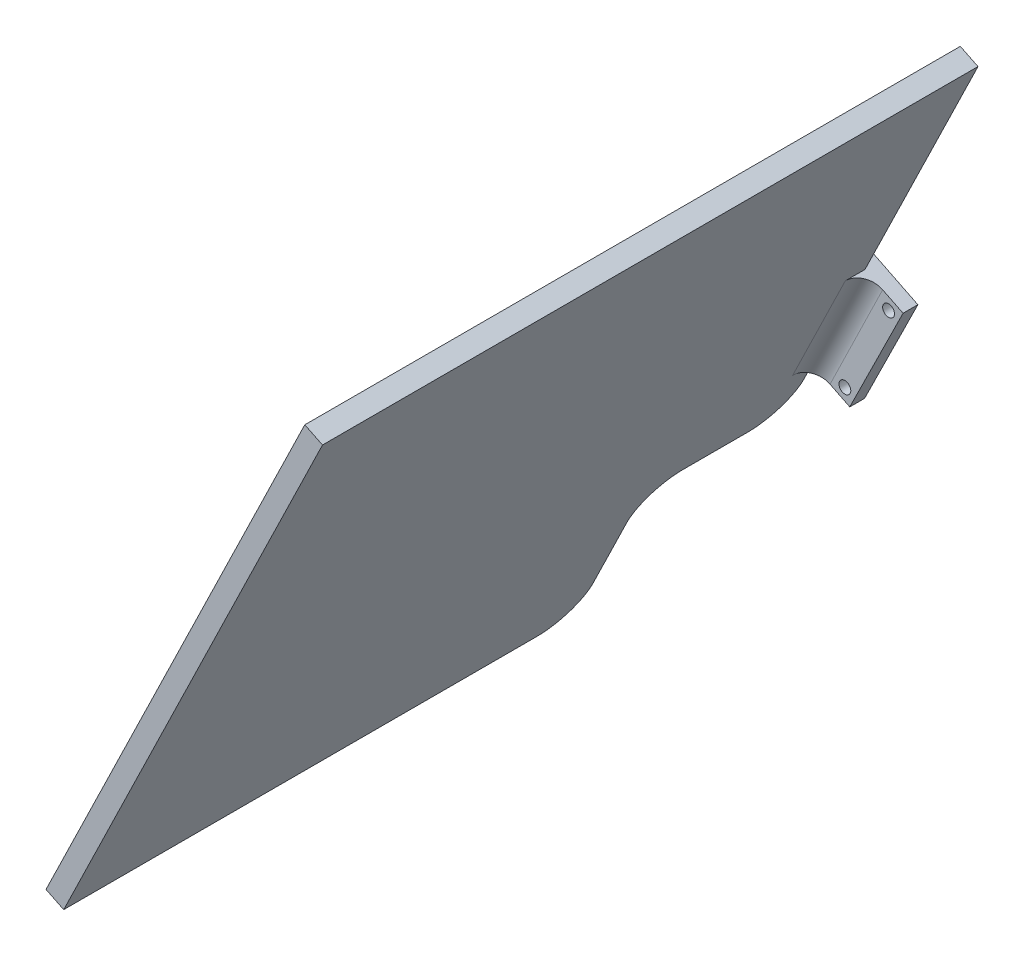
ISO-10303-21;
HEADER;
FILE_DESCRIPTION(('STEP AP214'),'2;1');
FILE_NAME('part.step','',(''),(''),'','','');
FILE_SCHEMA(('AUTOMOTIVE_DESIGN { 1 0 10303 214 1 1 1 1 }'));
ENDSEC;
DATA;
#1=APPLICATION_CONTEXT('core data for automotive mechanical design processes');
#2=APPLICATION_PROTOCOL_DEFINITION('international standard','automotive_design',2000,#1);
#3=PRODUCT_CONTEXT('',#1,'mechanical');
#4=PRODUCT('Part','Part','',(#3));
#5=PRODUCT_RELATED_PRODUCT_CATEGORY('part','',(#4));
#6=PRODUCT_DEFINITION_FORMATION('','',#4);
#7=PRODUCT_DEFINITION_CONTEXT('part definition',#1,'design');
#8=PRODUCT_DEFINITION('design','',#6,#7);
#9=PRODUCT_DEFINITION_SHAPE('','',#8);
#10=(LENGTH_UNIT() NAMED_UNIT(*) SI_UNIT(.MILLI.,.METRE.));
#11=(NAMED_UNIT(*) PLANE_ANGLE_UNIT() SI_UNIT($,.RADIAN.));
#12=(NAMED_UNIT(*) SI_UNIT($,.STERADIAN.) SOLID_ANGLE_UNIT());
#13=UNCERTAINTY_MEASURE_WITH_UNIT(LENGTH_MEASURE(1.E-05),#10,'distance_accuracy_value','');
#14=(GEOMETRIC_REPRESENTATION_CONTEXT(3) GLOBAL_UNCERTAINTY_ASSIGNED_CONTEXT((#13)) GLOBAL_UNIT_ASSIGNED_CONTEXT((#10,
#11,#12)) REPRESENTATION_CONTEXT('',''));
#15=CARTESIAN_POINT('',(0.,0.,0.));
#16=DIRECTION('',(0.,0.,1.));
#17=DIRECTION('',(1.,0.,0.));
#18=AXIS2_PLACEMENT_3D('',#15,#16,#17);
#19=CARTESIAN_POINT('',(0.,0.,3.));
#20=DIRECTION('',(0.,0.,-1.));
#21=DIRECTION('',(-1.,0.,0.));
#22=AXIS2_PLACEMENT_3D('',#19,#20,#21);
#23=PLANE('',#22);
#24=CARTESIAN_POINT('',(-75.4418609019395,-18.6400697773942,3.));
#25=DIRECTION('',(0.,0.,1.));
#26=DIRECTION('',(1.,0.,0.));
#27=AXIS2_PLACEMENT_3D('',#24,#25,#26);
#28=CIRCLE('',#27,1.2);
#29=CARTESIAN_POINT('',(-74.2418609019395,-18.6400697773942,3.));
#30=VERTEX_POINT('',#29);
#31=EDGE_CURVE('E213',#30,#30,#28,.T.);
#32=ORIENTED_EDGE('',*,*,#31,.F.);
#33=EDGE_LOOP('',(#32));
#34=FACE_BOUND('',#33,.T.);
#35=CARTESIAN_POINT('',(-66.577549393731,-0.711768645233306,3.));
#36=DIRECTION('',(0.,0.,1.));
#37=DIRECTION('',(1.,0.,0.));
#38=AXIS2_PLACEMENT_3D('',#35,#36,#37);
#39=CIRCLE('',#38,1.2);
#40=CARTESIAN_POINT('',(-65.377549393731,-0.711768645233306,3.));
#41=VERTEX_POINT('',#40);
#42=EDGE_CURVE('E219',#41,#41,#39,.T.);
#43=ORIENTED_EDGE('',*,*,#42,.F.);
#44=EDGE_LOOP('',(#43));
#45=FACE_BOUND('',#44,.T.);
#46=DIRECTION('',(0.896415056608047,-0.443215575410423,0.));
#47=VECTOR('',#46,1.);
#48=CARTESIAN_POINT('',(-78.3890482923801,-19.637108636029,3.));
#49=LINE('',#48,#47);
#50=CARTESIAN_POINT('',(-78.3890482923801,-19.637108636029,3.));
#51=VERTEX_POINT('',#50);
#52=CARTESIAN_POINT('',(-71.2822334900414,-23.1509396328807,3.));
#53=VERTEX_POINT('',#52);
#54=EDGE_CURVE('E233',#51,#53,#49,.T.);
#55=ORIENTED_EDGE('',*,*,#54,.T.);
#56=DIRECTION('',(-0.43756735035658,-0.899185639288085,0.));
#57=VECTOR('',#56,1.);
#58=CARTESIAN_POINT('',(-60.6163902256522,-1.23300383072171,3.));
#59=LINE('',#58,#57);
#60=CARTESIAN_POINT('',(-60.6053788539968,-1.21037584613058,3.));
#61=VERTEX_POINT('',#60);
#62=EDGE_CURVE('E267',#53,#61,#59,.F.);
#63=ORIENTED_EDGE('',*,*,#62,.T.);
#64=DIRECTION('',(-0.896415056608047,0.443215575410423,0.));
#65=VECTOR('',#64,1.);
#66=CARTESIAN_POINT('',(-67.5745882523658,2.23541874520732,3.));
#67=LINE('',#66,#65);
#68=CARTESIAN_POINT('',(-67.5745882523658,2.23541874520732,3.));
#69=VERTEX_POINT('',#68);
#70=EDGE_CURVE('E230',#61,#69,#67,.T.);
#71=ORIENTED_EDGE('',*,*,#70,.T.);
#72=DIRECTION('',(-0.443215575410423,-0.896415056608047,0.));
#73=VECTOR('',#72,1.);
#74=CARTESIAN_POINT('',(-67.5745882523658,2.23541874520732,3.));
#75=LINE('',#74,#73);
#76=EDGE_CURVE('E228',#69,#51,#75,.T.);
#77=ORIENTED_EDGE('',*,*,#76,.T.);
#78=EDGE_LOOP('',(#55,#63,#71,#77));
#79=FACE_BOUND('',#78,.T.);
#80=ADVANCED_FACE('F41',(#34,#45,#79),#23,.F.);
#81=CARTESIAN_POINT('',(-48.6492482615701,-9.57608015344176,3.));
#82=DIRECTION('',(0.,0.,1.));
#83=DIRECTION('',(1.,0.,0.));
#84=AXIS2_PLACEMENT_3D('',#81,#82,#83);
#85=CIRCLE('',#84,1.19999999999999);
#86=CARTESIAN_POINT('',(-47.4492482615701,-9.57608015344176,3.));
#87=VERTEX_POINT('',#86);
#88=EDGE_CURVE('E198',#87,#87,#85,.T.);
#89=ORIENTED_EDGE('',*,*,#88,.F.);
#90=EDGE_LOOP('',(#89));
#91=FACE_BOUND('',#90,.T.);
#92=CARTESIAN_POINT('',(-57.5135597697786,-27.5043812856027,3.));
#93=DIRECTION('',(0.,0.,1.));
#94=DIRECTION('',(1.,0.,0.));
#95=AXIS2_PLACEMENT_3D('',#92,#93,#94);
#96=CIRCLE('',#95,1.20000000000001);
#97=CARTESIAN_POINT('',(-56.3135597697786,-27.5043812856027,3.));
#98=VERTEX_POINT('',#97);
#99=EDGE_CURVE('E207',#98,#98,#96,.T.);
#100=ORIENTED_EDGE('',*,*,#99,.F.);
#101=EDGE_LOOP('',(#100));
#102=FACE_BOUND('',#101,.T.);
#103=CARTESIAN_POINT('',(-45.7027477813137,-8.5787016649778,3.));
#104=VERTEX_POINT('',#103);
#105=CARTESIAN_POINT('',(-49.8481852975061,-6.52906800418295,3.));
#106=VERTEX_POINT('',#105);
#107=EDGE_CURVE('E225',#104,#106,#67,.T.);
#108=ORIENTED_EDGE('',*,*,#107,.T.);
#109=DIRECTION('',(0.43756735035658,0.899185639288085,0.));
#110=VECTOR('',#109,1.);
#111=CARTESIAN_POINT('',(-60.5140285618953,-28.4470038063419,3.));
#112=LINE('',#111,#110);
#113=CARTESIAN_POINT('',(-60.5250399335508,-28.469631790933,3.));
#114=VERTEX_POINT('',#113);
#115=EDGE_CURVE('E277',#106,#114,#112,.F.);
#116=ORIENTED_EDGE('',*,*,#115,.T.);
#117=CARTESIAN_POINT('',(-56.517207821328,-30.4512290462141,3.));
#118=VERTEX_POINT('',#117);
#119=EDGE_CURVE('E232',#114,#118,#49,.T.);
#120=ORIENTED_EDGE('',*,*,#119,.T.);
#121=DIRECTION('',(0.443215575410423,0.896415056608047,0.));
#122=VECTOR('',#121,1.);
#123=CARTESIAN_POINT('',(-45.7027477813137,-8.5787016649778,3.));
#124=LINE('',#123,#122);
#125=EDGE_CURVE('E236',#118,#104,#124,.T.);
#126=ORIENTED_EDGE('',*,*,#125,.T.);
#127=EDGE_LOOP('',(#108,#116,#120,#126));
#128=FACE_BOUND('',#127,.T.);
#129=ADVANCED_FACE('F409',(#91,#102,#128),#23,.F.);
#130=CARTESIAN_POINT('',(0.,0.,0.));
#131=DIRECTION('',(0.,0.,-1.));
#132=DIRECTION('',(-1.,0.,0.));
#133=AXIS2_PLACEMENT_3D('',#130,#131,#132);
#134=PLANE('',#133);
#135=CARTESIAN_POINT('',(-57.5135597697786,-27.5043812856027,0.));
#136=DIRECTION('',(0.,0.,1.));
#137=DIRECTION('',(1.,0.,0.));
#138=AXIS2_PLACEMENT_3D('',#135,#136,#137);
#139=CIRCLE('',#138,1.20000000000001);
#140=CARTESIAN_POINT('',(-56.3135597697786,-27.5043812856027,0.));
#141=VERTEX_POINT('',#140);
#142=EDGE_CURVE('E205',#141,#141,#139,.T.);
#143=ORIENTED_EDGE('',*,*,#142,.T.);
#144=EDGE_LOOP('',(#143));
#145=FACE_BOUND('',#144,.T.);
#146=CARTESIAN_POINT('',(-66.577549393731,-0.711768645233306,0.));
#147=DIRECTION('',(0.,0.,1.));
#148=DIRECTION('',(1.,0.,0.));
#149=AXIS2_PLACEMENT_3D('',#146,#147,#148);
#150=CIRCLE('',#149,1.2);
#151=CARTESIAN_POINT('',(-65.377549393731,-0.711768645233306,0.));
#152=VERTEX_POINT('',#151);
#153=EDGE_CURVE('E216',#152,#152,#150,.T.);
#154=ORIENTED_EDGE('',*,*,#153,.T.);
#155=EDGE_LOOP('',(#154));
#156=FACE_BOUND('',#155,.T.);
#157=DIRECTION('',(-0.896415056608047,0.443215575410423,0.));
#158=VECTOR('',#157,1.);
#159=CARTESIAN_POINT('',(-67.5745882523658,2.23541874520732,0.));
#160=LINE('',#159,#158);
#161=CARTESIAN_POINT('',(-45.7027477813137,-8.5787016649778,0.));
#162=VERTEX_POINT('',#161);
#163=CARTESIAN_POINT('',(-67.5745882523658,2.23541874520732,0.));
#164=VERTEX_POINT('',#163);
#165=EDGE_CURVE('E222',#162,#164,#160,.T.);
#166=ORIENTED_EDGE('',*,*,#165,.F.);
#167=DIRECTION('',(0.443215575410423,0.896415056608047,0.));
#168=VECTOR('',#167,1.);
#169=CARTESIAN_POINT('',(-45.7027477813137,-8.5787016649778,0.));
#170=LINE('',#169,#168);
#171=CARTESIAN_POINT('',(-56.517207821328,-30.4512290462141,0.));
#172=VERTEX_POINT('',#171);
#173=EDGE_CURVE('E246',#172,#162,#170,.T.);
#174=ORIENTED_EDGE('',*,*,#173,.F.);
#175=DIRECTION('',(0.896415056608047,-0.443215575410423,0.));
#176=VECTOR('',#175,1.);
#177=CARTESIAN_POINT('',(-78.3890482923801,-19.637108636029,0.));
#178=LINE('',#177,#176);
#179=CARTESIAN_POINT('',(-78.3890482923801,-19.637108636029,0.));
#180=VERTEX_POINT('',#179);
#181=EDGE_CURVE('E244',#180,#172,#178,.T.);
#182=ORIENTED_EDGE('',*,*,#181,.F.);
#183=DIRECTION('',(-0.443215575410423,-0.896415056608047,0.));
#184=VECTOR('',#183,1.);
#185=CARTESIAN_POINT('',(-67.5745882523658,2.23541874520732,0.));
#186=LINE('',#185,#184);
#187=EDGE_CURVE('E242',#164,#180,#186,.T.);
#188=ORIENTED_EDGE('',*,*,#187,.F.);
#189=EDGE_LOOP('',(#166,#174,#182,#188));
#190=FACE_BOUND('',#189,.T.);
#191=CARTESIAN_POINT('',(-75.4418609019395,-18.6400697773942,0.));
#192=DIRECTION('',(0.,0.,1.));
#193=DIRECTION('',(1.,0.,0.));
#194=AXIS2_PLACEMENT_3D('',#191,#192,#193);
#195=CIRCLE('',#194,1.2);
#196=CARTESIAN_POINT('',(-74.2418609019395,-18.6400697773942,0.));
#197=VERTEX_POINT('',#196);
#198=EDGE_CURVE('E210',#197,#197,#195,.T.);
#199=ORIENTED_EDGE('',*,*,#198,.T.);
#200=EDGE_LOOP('',(#199));
#201=FACE_BOUND('',#200,.T.);
#202=CARTESIAN_POINT('',(-48.6492482615701,-9.57608015344176,0.));
#203=DIRECTION('',(0.,0.,1.));
#204=DIRECTION('',(1.,0.,0.));
#205=AXIS2_PLACEMENT_3D('',#202,#203,#204);
#206=CIRCLE('',#205,1.19999999999999);
#207=CARTESIAN_POINT('',(-47.4492482615701,-9.57608015344176,0.));
#208=VERTEX_POINT('',#207);
#209=EDGE_CURVE('E195',#208,#208,#206,.T.);
#210=ORIENTED_EDGE('',*,*,#209,.T.);
#211=EDGE_LOOP('',(#210));
#212=FACE_BOUND('',#211,.T.);
#213=ADVANCED_FACE('F372',(#145,#156,#190,#201,#212),#134,.T.);
#214=CARTESIAN_POINT('',(-67.5745882523658,2.23541874520732,3.));
#215=DIRECTION('',(-0.443215575410423,-0.896415056608047,0.));
#216=DIRECTION('',(0.896415056608047,-0.443215575410423,0.));
#217=AXIS2_PLACEMENT_3D('',#214,#215,#216);
#218=PLANE('',#217);
#219=ORIENTED_EDGE('',*,*,#165,.T.);
#220=DIRECTION('',(0.,0.,-1.));
#221=VECTOR('',#220,1.);
#222=CARTESIAN_POINT('',(-67.5745882523658,2.23541874520732,3.));
#223=LINE('',#222,#221);
#224=EDGE_CURVE('E256',#69,#164,#223,.T.);
#225=ORIENTED_EDGE('',*,*,#224,.F.);
#226=ORIENTED_EDGE('',*,*,#70,.F.);
#227=CARTESIAN_POINT('',(-60.6053788539967,-1.21037584613058,7.00000000000001));
#228=DIRECTION('',(-0.443215575410423,-0.896415056608047,0.));
#229=DIRECTION('',(-0.896415056608047,0.443215575410423,0.));
#230=AXIS2_PLACEMENT_3D('',#227,#228,#229);
#231=ELLIPSE('',#230,4.00007915871579,4.);
#232=CARTESIAN_POINT('',(-57.0196476684999,-2.98327323214804,7.00000000000001));
#233=VERTEX_POINT('',#232);
#234=EDGE_CURVE('E281',#61,#233,#231,.T.);
#235=ORIENTED_EDGE('',*,*,#234,.T.);
#236=DIRECTION('',(0.,0.,1.));
#237=VECTOR('',#236,1.);
#238=CARTESIAN_POINT('',(-57.0196476684999,-2.98327323214804,3.));
#239=LINE('',#238,#237);
#240=CARTESIAN_POINT('',(-57.0196476684999,-2.98327323214804,3.));
#241=VERTEX_POINT('',#240);
#242=EDGE_CURVE('E259',#241,#233,#239,.T.);
#243=ORIENTED_EDGE('',*,*,#242,.F.);
#244=CARTESIAN_POINT('',(-53.433916483003,-4.75617061816549,3.));
#245=VERTEX_POINT('',#244);
#246=EDGE_CURVE('E229',#245,#241,#67,.T.);
#247=ORIENTED_EDGE('',*,*,#246,.F.);
#248=DIRECTION('',(0.,0.,-1.));
#249=VECTOR('',#248,1.);
#250=CARTESIAN_POINT('',(-53.433916483003,-4.7561706181655,3.));
#251=LINE('',#250,#249);
#252=CARTESIAN_POINT('',(-53.433916483003,-4.7561706181655,7.00000000000001));
#253=VERTEX_POINT('',#252);
#254=EDGE_CURVE('E275',#253,#245,#251,.T.);
#255=ORIENTED_EDGE('',*,*,#254,.F.);
#256=CARTESIAN_POINT('',(-49.8481852975061,-6.52906800418296,7.00000000000001));
#257=DIRECTION('',(-0.443215575410423,-0.896415056608047,0.));
#258=DIRECTION('',(0.896415056608047,-0.443215575410423,0.));
#259=AXIS2_PLACEMENT_3D('',#256,#257,#258);
#260=ELLIPSE('',#259,4.00007915871579,4.);
#261=EDGE_CURVE('E283',#253,#106,#260,.T.);
#262=ORIENTED_EDGE('',*,*,#261,.T.);
#263=ORIENTED_EDGE('',*,*,#107,.F.);
#264=DIRECTION('',(0.,0.,-1.));
#265=VECTOR('',#264,1.);
#266=CARTESIAN_POINT('',(-45.7027477813137,-8.5787016649778,3.));
#267=LINE('',#266,#265);
#268=EDGE_CURVE('E239',#104,#162,#267,.T.);
#269=ORIENTED_EDGE('',*,*,#268,.T.);
#270=EDGE_LOOP('',(#219,#225,#226,#235,#243,#247,#255,#262,#263,#269));
#271=FACE_BOUND('',#270,.T.);
#272=ADVANCED_FACE('F366',(#271),#218,.F.);
#273=CARTESIAN_POINT('',(-67.5745882523658,2.23541874520732,3.));
#274=DIRECTION('',(0.896415056608047,-0.443215575410423,0.));
#275=DIRECTION('',(0.443215575410423,0.896415056608047,0.));
#276=AXIS2_PLACEMENT_3D('',#273,#274,#275);
#277=PLANE('',#276);
#278=ORIENTED_EDGE('',*,*,#187,.T.);
#279=DIRECTION('',(0.,0.,-1.));
#280=VECTOR('',#279,1.);
#281=CARTESIAN_POINT('',(-78.3890482923801,-19.637108636029,3.));
#282=LINE('',#281,#280);
#283=EDGE_CURVE('E253',#51,#180,#282,.T.);
#284=ORIENTED_EDGE('',*,*,#283,.F.);
#285=ORIENTED_EDGE('',*,*,#76,.F.);
#286=ORIENTED_EDGE('',*,*,#224,.T.);
#287=EDGE_LOOP('',(#278,#284,#285,#286));
#288=FACE_BOUND('',#287,.T.);
#289=ADVANCED_FACE('F364',(#288),#277,.F.);
#290=CARTESIAN_POINT('',(-78.3890482923801,-19.637108636029,3.));
#291=DIRECTION('',(0.443215575410423,0.896415056608047,0.));
#292=DIRECTION('',(-0.896415056608047,0.443215575410423,0.));
#293=AXIS2_PLACEMENT_3D('',#290,#291,#292);
#294=PLANE('',#293);
#295=ORIENTED_EDGE('',*,*,#181,.T.);
#296=DIRECTION('',(0.,0.,-1.));
#297=VECTOR('',#296,1.);
#298=CARTESIAN_POINT('',(-56.517207821328,-30.4512290462141,3.));
#299=LINE('',#298,#297);
#300=EDGE_CURVE('E250',#118,#172,#299,.T.);
#301=ORIENTED_EDGE('',*,*,#300,.F.);
#302=ORIENTED_EDGE('',*,*,#119,.F.);
#303=CARTESIAN_POINT('',(-60.5250399335508,-28.469631790933,7.00000000000001));
#304=DIRECTION('',(0.443215575410423,0.896415056608047,0.));
#305=DIRECTION('',(0.896415056608047,-0.443215575410423,0.));
#306=AXIS2_PLACEMENT_3D('',#303,#304,#305);
#307=ELLIPSE('',#306,4.00007915871579,4.);
#308=CARTESIAN_POINT('',(-64.1107711190477,-26.6967344049156,7.00000000000001));
#309=VERTEX_POINT('',#308);
#310=EDGE_CURVE('E285',#114,#309,#307,.T.);
#311=ORIENTED_EDGE('',*,*,#310,.T.);
#312=DIRECTION('',(0.,0.,1.));
#313=VECTOR('',#312,1.);
#314=CARTESIAN_POINT('',(-64.1107711190477,-26.6967344049156,3.));
#315=LINE('',#314,#313);
#316=CARTESIAN_POINT('',(-64.1107711190477,-26.6967344049156,3.));
#317=VERTEX_POINT('',#316);
#318=EDGE_CURVE('E269',#317,#309,#315,.T.);
#319=ORIENTED_EDGE('',*,*,#318,.F.);
#320=CARTESIAN_POINT('',(-67.6965023045445,-24.9238370188981,3.));
#321=VERTEX_POINT('',#320);
#322=EDGE_CURVE('E237',#321,#317,#49,.T.);
#323=ORIENTED_EDGE('',*,*,#322,.F.);
#324=DIRECTION('',(0.,0.,-1.));
#325=VECTOR('',#324,1.);
#326=CARTESIAN_POINT('',(-67.6965023045445,-24.9238370188981,3.));
#327=LINE('',#326,#325);
#328=CARTESIAN_POINT('',(-67.6965023045445,-24.9238370188981,7.00000000000001));
#329=VERTEX_POINT('',#328);
#330=EDGE_CURVE('E265',#329,#321,#327,.T.);
#331=ORIENTED_EDGE('',*,*,#330,.F.);
#332=CARTESIAN_POINT('',(-71.2822334900414,-23.1509396328807,7.00000000000001));
#333=DIRECTION('',(0.443215575410423,0.896415056608047,0.));
#334=DIRECTION('',(-0.896415056608047,0.443215575410423,0.));
#335=AXIS2_PLACEMENT_3D('',#332,#333,#334);
#336=ELLIPSE('',#335,4.00007915871579,4.);
#337=EDGE_CURVE('E279',#329,#53,#336,.T.);
#338=ORIENTED_EDGE('',*,*,#337,.T.);
#339=ORIENTED_EDGE('',*,*,#54,.F.);
#340=ORIENTED_EDGE('',*,*,#283,.T.);
#341=EDGE_LOOP('',(#295,#301,#302,#311,#319,#323,#331,#338,#339,#340));
#342=FACE_BOUND('',#341,.T.);
#343=ADVANCED_FACE('F376',(#342),#294,.F.);
#344=CARTESIAN_POINT('',(-45.7027477813137,-8.5787016649778,3.));
#345=DIRECTION('',(-0.896415056608047,0.443215575410423,0.));
#346=DIRECTION('',(-0.443215575410423,-0.896415056608047,0.));
#347=AXIS2_PLACEMENT_3D('',#344,#345,#346);
#348=PLANE('',#347);
#349=ORIENTED_EDGE('',*,*,#173,.T.);
#350=ORIENTED_EDGE('',*,*,#268,.F.);
#351=ORIENTED_EDGE('',*,*,#125,.F.);
#352=ORIENTED_EDGE('',*,*,#300,.T.);
#353=EDGE_LOOP('',(#349,#350,#351,#352));
#354=FACE_BOUND('',#353,.T.);
#355=ADVANCED_FACE('F425',(#354),#348,.F.);
#356=CARTESIAN_POINT('',(-66.577549393731,-0.711768645233306,3.));
#357=DIRECTION('',(0.,0.,-1.));
#358=DIRECTION('',(-1.,0.,0.));
#359=AXIS2_PLACEMENT_3D('',#356,#357,#358);
#360=CYLINDRICAL_SURFACE('',#359,1.2);
#361=ORIENTED_EDGE('',*,*,#42,.T.);
#362=EDGE_LOOP('',(#361));
#363=FACE_BOUND('',#362,.T.);
#364=ORIENTED_EDGE('',*,*,#153,.F.);
#365=EDGE_LOOP('',(#364));
#366=FACE_BOUND('',#365,.T.);
#367=ADVANCED_FACE('F420',(#363,#366),#360,.F.);
#368=CARTESIAN_POINT('',(-75.4418609019395,-18.6400697773942,3.));
#369=DIRECTION('',(0.,0.,-1.));
#370=DIRECTION('',(-1.,0.,0.));
#371=AXIS2_PLACEMENT_3D('',#368,#369,#370);
#372=CYLINDRICAL_SURFACE('',#371,1.2);
#373=ORIENTED_EDGE('',*,*,#31,.T.);
#374=EDGE_LOOP('',(#373));
#375=FACE_BOUND('',#374,.T.);
#376=ORIENTED_EDGE('',*,*,#198,.F.);
#377=EDGE_LOOP('',(#376));
#378=FACE_BOUND('',#377,.T.);
#379=ADVANCED_FACE('F560',(#375,#378),#372,.F.);
#380=CARTESIAN_POINT('',(-57.5135597697786,-27.5043812856027,3.));
#381=DIRECTION('',(0.,0.,-1.));
#382=DIRECTION('',(-1.,0.,0.));
#383=AXIS2_PLACEMENT_3D('',#380,#381,#382);
#384=CYLINDRICAL_SURFACE('',#383,1.20000000000001);
#385=ORIENTED_EDGE('',*,*,#99,.T.);
#386=EDGE_LOOP('',(#385));
#387=FACE_BOUND('',#386,.T.);
#388=ORIENTED_EDGE('',*,*,#142,.F.);
#389=EDGE_LOOP('',(#388));
#390=FACE_BOUND('',#389,.T.);
#391=ADVANCED_FACE('F550',(#387,#390),#384,.F.);
#392=CARTESIAN_POINT('',(-48.6492482615701,-9.57608015344176,3.));
#393=DIRECTION('',(0.,0.,-1.));
#394=DIRECTION('',(-1.,0.,0.));
#395=AXIS2_PLACEMENT_3D('',#392,#393,#394);
#396=CYLINDRICAL_SURFACE('',#395,1.19999999999999);
#397=ORIENTED_EDGE('',*,*,#88,.T.);
#398=EDGE_LOOP('',(#397));
#399=FACE_BOUND('',#398,.T.);
#400=ORIENTED_EDGE('',*,*,#209,.F.);
#401=EDGE_LOOP('',(#400));
#402=FACE_BOUND('',#401,.T.);
#403=ADVANCED_FACE('F533',(#399,#402),#396,.F.);
#404=CARTESIAN_POINT('',(0.,0.,3.));
#405=DIRECTION('',(0.,0.,1.));
#406=DIRECTION('',(1.,0.,0.));
#407=AXIS2_PLACEMENT_3D('',#404,#405,#406);
#408=PLANE('',#407);
#409=DIRECTION('',(0.43756735035658,0.899185639288085,0.));
#410=VECTOR('',#409,1.);
#411=CARTESIAN_POINT('',(-83.0099072399224,-65.5337997869481,3.));
#412=LINE('',#411,#410);
#413=CARTESIAN_POINT('',(-30.5018251971327,42.368476927622,3.));
#414=VERTEX_POINT('',#413);
#415=EDGE_CURVE('E329',#245,#414,#412,.T.);
#416=ORIENTED_EDGE('',*,*,#415,.F.);
#417=ORIENTED_EDGE('',*,*,#246,.T.);
#418=DIRECTION('',(-0.43756735035658,-0.899185639288085,0.));
#419=VECTOR('',#418,1.);
#420=CARTESIAN_POINT('',(-86.6066497970747,-63.7835303855218,3.));
#421=LINE('',#420,#419);
#422=CARTESIAN_POINT('',(-34.0985677542851,44.1187463290484,3.));
#423=VERTEX_POINT('',#422);
#424=EDGE_CURVE('E192',#423,#241,#421,.T.);
#425=ORIENTED_EDGE('',*,*,#424,.F.);
#426=DIRECTION('',(-0.899185639288085,0.43756735035658,0.));
#427=VECTOR('',#426,1.);
#428=CARTESIAN_POINT('',(-34.0985677542851,44.1187463290484,3.));
#429=LINE('',#428,#427);
#430=EDGE_CURVE('E339',#414,#423,#429,.T.);
#431=ORIENTED_EDGE('',*,*,#430,.F.);
#432=EDGE_LOOP('',(#416,#417,#425,#431));
#433=FACE_BOUND('',#432,.T.);
#434=ADVANCED_FACE('F352',(#433),#408,.F.);
#435=CARTESIAN_POINT('',(-65.7596104751371,-30.085041757556,3.));
#436=VERTEX_POINT('',#435);
#437=EDGE_CURVE('E331',#436,#317,#412,.T.);
#438=ORIENTED_EDGE('',*,*,#437,.F.);
#439=DIRECTION('',(-0.899185639288085,0.43756735035658,0.));
#440=VECTOR('',#439,1.);
#441=CARTESIAN_POINT('',(-24.4277644305088,-50.198203677505,3.));
#442=LINE('',#441,#440);
#443=CARTESIAN_POINT('',(-69.3563530322894,-28.3347723561297,3.));
#444=VERTEX_POINT('',#443);
#445=EDGE_CURVE('E287',#436,#444,#442,.T.);
#446=ORIENTED_EDGE('',*,*,#445,.T.);
#447=EDGE_CURVE('E341',#321,#444,#421,.T.);
#448=ORIENTED_EDGE('',*,*,#447,.F.);
#449=ORIENTED_EDGE('',*,*,#322,.T.);
#450=EDGE_LOOP('',(#438,#446,#448,#449));
#451=FACE_BOUND('',#450,.T.);
#452=ADVANCED_FACE('F388',(#451),#408,.F.);
#453=CARTESIAN_POINT('',(-86.6066497970747,-63.7835303855218,136.));
#454=DIRECTION('',(0.43756735035658,0.899185639288085,0.));
#455=DIRECTION('',(-0.899185639288085,0.43756735035658,0.));
#456=AXIS2_PLACEMENT_3D('',#453,#454,#455);
#457=PLANE('',#456);
#458=DIRECTION('',(0.,0.,-1.));
#459=VECTOR('',#458,1.);
#460=CARTESIAN_POINT('',(-86.6066497970747,-63.7835303855218,136.));
#461=LINE('',#460,#459);
#462=CARTESIAN_POINT('',(-86.6066497970747,-63.7835303855218,136.));
#463=VERTEX_POINT('',#462);
#464=CARTESIAN_POINT('',(-86.6066497970747,-63.7835303855218,40.0772883040732));
#465=VERTEX_POINT('',#464);
#466=EDGE_CURVE('E337',#463,#465,#461,.T.);
#467=ORIENTED_EDGE('',*,*,#466,.T.);
#468=DIRECTION('',(-0.899185639288085,0.43756735035658,0.));
#469=VECTOR('',#468,1.);
#470=CARTESIAN_POINT('',(-86.6066497970747,-63.7835303855218,40.0772883040732));
#471=LINE('',#470,#469);
#472=CARTESIAN_POINT('',(-83.0099072399224,-65.5337997869481,40.0772883040732));
#473=VERTEX_POINT('',#472);
#474=EDGE_CURVE('E56',#465,#473,#471,.F.);
#475=ORIENTED_EDGE('',*,*,#474,.T.);
#476=DIRECTION('',(0.,0.,-1.));
#477=VECTOR('',#476,1.);
#478=CARTESIAN_POINT('',(-83.0099072399224,-65.5337997869481,136.));
#479=LINE('',#478,#477);
#480=CARTESIAN_POINT('',(-83.0099072399224,-65.5337997869481,136.));
#481=VERTEX_POINT('',#480);
#482=EDGE_CURVE('E178',#481,#473,#479,.T.);
#483=ORIENTED_EDGE('',*,*,#482,.F.);
#484=DIRECTION('',(0.899185639288085,-0.43756735035658,0.));
#485=VECTOR('',#484,1.);
#486=CARTESIAN_POINT('',(-86.6066497970747,-63.7835303855218,136.));
#487=LINE('',#486,#485);
#488=EDGE_CURVE('E185',#463,#481,#487,.T.);
#489=ORIENTED_EDGE('',*,*,#488,.F.);
#490=EDGE_LOOP('',(#467,#475,#483,#489));
#491=FACE_BOUND('',#490,.T.);
#492=ADVANCED_FACE('F194',(#491),#457,.F.);
#493=CARTESIAN_POINT('',(-83.0099072399224,-65.5337997869481,136.));
#494=DIRECTION('',(-0.899185639288085,0.43756735035658,0.));
#495=DIRECTION('',(-0.43756735035658,-0.899185639288085,0.));
#496=AXIS2_PLACEMENT_3D('',#493,#494,#495);
#497=PLANE('',#496);
#498=DIRECTION('',(0.,0.,-1.));
#499=VECTOR('',#498,1.);
#500=CARTESIAN_POINT('',(-69.2601492779897,-37.2785268718607,3.));
#501=LINE('',#500,#499);
#502=CARTESIAN_POINT('',(-69.2601492779897,-37.2785268718607,24.0772883040732));
#503=VERTEX_POINT('',#502);
#504=CARTESIAN_POINT('',(-69.2601492779897,-37.2785268718607,11.));
#505=VERTEX_POINT('',#504);
#506=EDGE_CURVE('E323',#503,#505,#501,.T.);
#507=ORIENTED_EDGE('',*,*,#506,.T.);
#508=CARTESIAN_POINT('',(-65.7596104751371,-30.085041757556,11.));
#509=DIRECTION('',(-0.899185639288085,0.43756735035658,0.));
#510=DIRECTION('',(-0.43756735035658,-0.899185639288085,0.));
#511=AXIS2_PLACEMENT_3D('',#508,#509,#510);
#512=CIRCLE('',#511,8.);
#513=EDGE_CURVE('E301',#505,#436,#512,.F.);
#514=ORIENTED_EDGE('',*,*,#513,.T.);
#515=ORIENTED_EDGE('',*,*,#437,.T.);
#516=ORIENTED_EDGE('',*,*,#318,.T.);
#517=DIRECTION('',(0.43756735035658,0.899185639288085,0.));
#518=VECTOR('',#517,1.);
#519=CARTESIAN_POINT('',(-53.433916483003,-4.7561706181655,7.00000000000001));
#520=LINE('',#519,#518);
#521=EDGE_CURVE('E272',#309,#253,#520,.T.);
#522=ORIENTED_EDGE('',*,*,#521,.T.);
#523=ORIENTED_EDGE('',*,*,#254,.T.);
#524=ORIENTED_EDGE('',*,*,#415,.T.);
#525=DIRECTION('',(0.,0.,-1.));
#526=VECTOR('',#525,1.);
#527=CARTESIAN_POINT('',(-30.5018251971327,42.368476927622,136.));
#528=LINE('',#527,#526);
#529=CARTESIAN_POINT('',(-30.5018251971327,42.368476927622,136.));
#530=VERTEX_POINT('',#529);
#531=EDGE_CURVE('E181',#530,#414,#528,.T.);
#532=ORIENTED_EDGE('',*,*,#531,.F.);
#533=DIRECTION('',(0.43756735035658,0.899185639288085,0.));
#534=VECTOR('',#533,1.);
#535=CARTESIAN_POINT('',(-83.0099072399224,-65.5337997869481,136.));
#536=LINE('',#535,#534);
#537=EDGE_CURVE('E174',#481,#530,#536,.T.);
#538=ORIENTED_EDGE('',*,*,#537,.F.);
#539=ORIENTED_EDGE('',*,*,#482,.T.);
#540=CARTESIAN_POINT('',(-79.5093684370697,-58.3403146726434,40.0772883040732));
#541=DIRECTION('',(-0.899185639288085,0.43756735035658,0.));
#542=DIRECTION('',(-0.43756735035658,-0.899185639288085,0.));
#543=AXIS2_PLACEMENT_3D('',#540,#541,#542);
#544=CIRCLE('',#543,8.);
#545=CARTESIAN_POINT('',(-79.5093684370697,-58.3403146726434,32.0772883040732));
#546=VERTEX_POINT('',#545);
#547=EDGE_CURVE('E299',#473,#546,#544,.F.);
#548=ORIENTED_EDGE('',*,*,#547,.T.);
#549=DIRECTION('',(0.43756735035658,0.899185639288085,0.));
#550=VECTOR('',#549,1.);
#551=CARTESIAN_POINT('',(-69.2601492779897,-37.2785268718607,32.0772883040732));
#552=LINE('',#551,#550);
#553=CARTESIAN_POINT('',(-72.7606880808424,-44.4720119861654,32.0772883040732));
#554=VERTEX_POINT('',#553);
#555=EDGE_CURVE('E325',#546,#554,#552,.T.);
#556=ORIENTED_EDGE('',*,*,#555,.T.);
#557=CARTESIAN_POINT('',(-72.7606880808424,-44.4720119861654,24.0772883040732));
#558=DIRECTION('',(-0.899185639288085,0.43756735035658,0.));
#559=DIRECTION('',(-0.43756735035658,-0.899185639288085,0.));
#560=AXIS2_PLACEMENT_3D('',#557,#558,#559);
#561=CIRCLE('',#560,8.);
#562=EDGE_CURVE('E11',#554,#503,#561,.T.);
#563=ORIENTED_EDGE('',*,*,#562,.T.);
#564=EDGE_LOOP('',(#507,#514,#515,#516,#522,#523,#524,#532,#538,#539,#548,#556,#563));
#565=FACE_BOUND('',#564,.T.);
#566=ADVANCED_FACE('F177',(#565),#497,.F.);
#567=CARTESIAN_POINT('',(-34.0985677542851,44.1187463290484,136.));
#568=DIRECTION('',(-0.43756735035658,-0.899185639288085,0.));
#569=DIRECTION('',(0.899185639288085,-0.43756735035658,0.));
#570=AXIS2_PLACEMENT_3D('',#567,#568,#569);
#571=PLANE('',#570);
#572=ORIENTED_EDGE('',*,*,#430,.T.);
#573=DIRECTION('',(0.,0.,-1.));
#574=VECTOR('',#573,1.);
#575=CARTESIAN_POINT('',(-34.0985677542851,44.1187463290484,136.));
#576=LINE('',#575,#574);
#577=CARTESIAN_POINT('',(-34.0985677542851,44.1187463290484,136.));
#578=VERTEX_POINT('',#577);
#579=EDGE_CURVE('E200',#578,#423,#576,.T.);
#580=ORIENTED_EDGE('',*,*,#579,.F.);
#581=DIRECTION('',(-0.899185639288085,0.43756735035658,0.));
#582=VECTOR('',#581,1.);
#583=CARTESIAN_POINT('',(-34.0985677542851,44.1187463290484,136.));
#584=LINE('',#583,#582);
#585=EDGE_CURVE('E184',#530,#578,#584,.T.);
#586=ORIENTED_EDGE('',*,*,#585,.F.);
#587=ORIENTED_EDGE('',*,*,#531,.T.);
#588=EDGE_LOOP('',(#572,#580,#586,#587));
#589=FACE_BOUND('',#588,.T.);
#590=ADVANCED_FACE('F397',(#589),#571,.F.);
#591=CARTESIAN_POINT('',(-86.6066497970747,-63.7835303855218,136.));
#592=DIRECTION('',(0.899185639288085,-0.43756735035658,0.));
#593=DIRECTION('',(0.43756735035658,0.899185639288085,0.));
#594=AXIS2_PLACEMENT_3D('',#591,#592,#593);
#595=PLANE('',#594);
#596=ORIENTED_EDGE('',*,*,#447,.T.);
#597=CARTESIAN_POINT('',(-69.3563530322894,-28.3347723561297,11.));
#598=DIRECTION('',(0.899185639288085,-0.43756735035658,0.));
#599=DIRECTION('',(0.43756735035658,0.899185639288085,0.));
#600=AXIS2_PLACEMENT_3D('',#597,#598,#599);
#601=CIRCLE('',#600,8.);
#602=CARTESIAN_POINT('',(-72.8568918351421,-35.5282574704344,11.));
#603=VERTEX_POINT('',#602);
#604=EDGE_CURVE('E292',#444,#603,#601,.F.);
#605=ORIENTED_EDGE('',*,*,#604,.T.);
#606=DIRECTION('',(0.,0.,-1.));
#607=VECTOR('',#606,1.);
#608=CARTESIAN_POINT('',(-72.8568918351421,-35.5282574704344,3.));
#609=LINE('',#608,#607);
#610=CARTESIAN_POINT('',(-72.8568918351421,-35.5282574704344,24.0772883040732));
#611=VERTEX_POINT('',#610);
#612=EDGE_CURVE('E314',#611,#603,#609,.T.);
#613=ORIENTED_EDGE('',*,*,#612,.F.);
#614=CARTESIAN_POINT('',(-76.3574306379947,-42.7217425847391,24.0772883040732));
#615=DIRECTION('',(0.899185639288085,-0.43756735035658,0.));
#616=DIRECTION('',(0.43756735035658,0.899185639288085,0.));
#617=AXIS2_PLACEMENT_3D('',#614,#615,#616);
#618=CIRCLE('',#617,8.);
#619=CARTESIAN_POINT('',(-76.3574306379947,-42.7217425847391,32.0772883040732));
#620=VERTEX_POINT('',#619);
#621=EDGE_CURVE('E49',#611,#620,#618,.T.);
#622=ORIENTED_EDGE('',*,*,#621,.T.);
#623=DIRECTION('',(0.43756735035658,0.899185639288085,0.));
#624=VECTOR('',#623,1.);
#625=CARTESIAN_POINT('',(-72.8568918351421,-35.5282574704344,32.0772883040732));
#626=LINE('',#625,#624);
#627=CARTESIAN_POINT('',(-83.1061109942221,-56.5900452712171,32.0772883040732));
#628=VERTEX_POINT('',#627);
#629=EDGE_CURVE('E312',#628,#620,#626,.T.);
#630=ORIENTED_EDGE('',*,*,#629,.F.);
#631=CARTESIAN_POINT('',(-83.106110994222,-56.5900452712171,40.0772883040732));
#632=DIRECTION('',(0.899185639288085,-0.43756735035658,0.));
#633=DIRECTION('',(0.43756735035658,0.899185639288085,0.));
#634=AXIS2_PLACEMENT_3D('',#631,#632,#633);
#635=CIRCLE('',#634,8.);
#636=EDGE_CURVE('E290',#628,#465,#635,.F.);
#637=ORIENTED_EDGE('',*,*,#636,.T.);
#638=ORIENTED_EDGE('',*,*,#466,.F.);
#639=DIRECTION('',(-0.43756735035658,-0.899185639288085,0.));
#640=VECTOR('',#639,1.);
#641=CARTESIAN_POINT('',(-86.6066497970747,-63.7835303855218,136.));
#642=LINE('',#641,#640);
#643=EDGE_CURVE('E190',#578,#463,#642,.T.);
#644=ORIENTED_EDGE('',*,*,#643,.F.);
#645=ORIENTED_EDGE('',*,*,#579,.T.);
#646=ORIENTED_EDGE('',*,*,#424,.T.);
#647=ORIENTED_EDGE('',*,*,#242,.T.);
#648=DIRECTION('',(-0.43756735035658,-0.899185639288085,0.));
#649=VECTOR('',#648,1.);
#650=CARTESIAN_POINT('',(-67.6965023045445,-24.9238370188981,7.00000000000001));
#651=LINE('',#650,#649);
#652=EDGE_CURVE('E262',#233,#329,#651,.T.);
#653=ORIENTED_EDGE('',*,*,#652,.T.);
#654=ORIENTED_EDGE('',*,*,#330,.T.);
#655=EDGE_LOOP('',(#596,#605,#613,#622,#630,#637,#638,#644,#645,#646,#647,#653,#654));
#656=FACE_BOUND('',#655,.T.);
#657=ADVANCED_FACE('F311',(#656),#595,.F.);
#658=CARTESIAN_POINT('',(0.,0.,136.));
#659=DIRECTION('',(0.,0.,1.));
#660=DIRECTION('',(1.,0.,0.));
#661=AXIS2_PLACEMENT_3D('',#658,#659,#660);
#662=PLANE('',#661);
#663=ORIENTED_EDGE('',*,*,#488,.T.);
#664=ORIENTED_EDGE('',*,*,#537,.T.);
#665=ORIENTED_EDGE('',*,*,#585,.T.);
#666=ORIENTED_EDGE('',*,*,#643,.T.);
#667=EDGE_LOOP('',(#663,#664,#665,#666));
#668=FACE_BOUND('',#667,.T.);
#669=ADVANCED_FACE('F188',(#668),#662,.T.);
#670=CARTESIAN_POINT('',(-90.203392354227,-62.0332609840955,7.00000000000001));
#671=DIRECTION('',(0.43756735035658,0.899185639288085,0.));
#672=DIRECTION('',(-0.899185639288085,0.43756735035658,0.));
#673=AXIS2_PLACEMENT_3D('',#670,#671,#672);
#674=CYLINDRICAL_SURFACE('',#673,4.);
#675=ORIENTED_EDGE('',*,*,#234,.F.);
#676=ORIENTED_EDGE('',*,*,#62,.F.);
#677=ORIENTED_EDGE('',*,*,#337,.F.);
#678=ORIENTED_EDGE('',*,*,#652,.F.);
#679=EDGE_LOOP('',(#675,#676,#677,#678));
#680=FACE_BOUND('',#679,.T.);
#681=ADVANCED_FACE('F380',(#680),#674,.F.);
#682=CARTESIAN_POINT('',(-79.41316468277,-67.2840691883744,7.00000000000001));
#683=DIRECTION('',(-0.43756735035658,-0.899185639288085,0.));
#684=DIRECTION('',(0.899185639288085,-0.43756735035658,0.));
#685=AXIS2_PLACEMENT_3D('',#682,#683,#684);
#686=CYLINDRICAL_SURFACE('',#685,4.);
#687=ORIENTED_EDGE('',*,*,#310,.F.);
#688=ORIENTED_EDGE('',*,*,#115,.F.);
#689=ORIENTED_EDGE('',*,*,#261,.F.);
#690=ORIENTED_EDGE('',*,*,#521,.F.);
#691=EDGE_LOOP('',(#687,#688,#689,#690));
#692=FACE_BOUND('',#691,.T.);
#693=ADVANCED_FACE('F395',(#692),#686,.F.);
#694=CARTESIAN_POINT('',(-69.2601492779897,-37.2785268718607,3.));
#695=DIRECTION('',(0.43756735035658,0.899185639288085,0.));
#696=DIRECTION('',(-0.899185639288085,0.43756735035658,0.));
#697=AXIS2_PLACEMENT_3D('',#694,#695,#696);
#698=PLANE('',#697);
#699=ORIENTED_EDGE('',*,*,#612,.T.);
#700=DIRECTION('',(-0.899185639288085,0.43756735035658,0.));
#701=VECTOR('',#700,1.);
#702=CARTESIAN_POINT('',(-69.2601492779897,-37.2785268718607,11.));
#703=LINE('',#702,#701);
#704=EDGE_CURVE('E297',#603,#505,#703,.F.);
#705=ORIENTED_EDGE('',*,*,#704,.T.);
#706=ORIENTED_EDGE('',*,*,#506,.F.);
#707=DIRECTION('',(-0.899185639288085,0.43756735035658,0.));
#708=VECTOR('',#707,1.);
#709=CARTESIAN_POINT('',(-72.8568918351421,-35.5282574704344,24.0772883040732));
#710=LINE('',#709,#708);
#711=EDGE_CURVE('E294',#503,#611,#710,.T.);
#712=ORIENTED_EDGE('',*,*,#711,.T.);
#713=EDGE_LOOP('',(#699,#705,#706,#712));
#714=FACE_BOUND('',#713,.T.);
#715=ADVANCED_FACE('F327',(#714),#698,.F.);
#716=CARTESIAN_POINT('',(-69.2601492779897,-37.2785268718607,32.0772883040732));
#717=DIRECTION('',(0.,0.,1.));
#718=DIRECTION('',(1.,0.,0.));
#719=AXIS2_PLACEMENT_3D('',#716,#717,#718);
#720=PLANE('',#719);
#721=ORIENTED_EDGE('',*,*,#629,.T.);
#722=DIRECTION('',(-0.899185639288085,0.43756735035658,0.));
#723=VECTOR('',#722,1.);
#724=CARTESIAN_POINT('',(-72.7606880808424,-44.4720119861654,32.0772883040732));
#725=LINE('',#724,#723);
#726=EDGE_CURVE('E64',#620,#554,#725,.F.);
#727=ORIENTED_EDGE('',*,*,#726,.T.);
#728=ORIENTED_EDGE('',*,*,#555,.F.);
#729=DIRECTION('',(-0.899185639288085,0.43756735035658,0.));
#730=VECTOR('',#729,1.);
#731=CARTESIAN_POINT('',(-79.5093684370697,-58.3403146726434,32.0772883040732));
#732=LINE('',#731,#730);
#733=EDGE_CURVE('E303',#546,#628,#732,.T.);
#734=ORIENTED_EDGE('',*,*,#733,.T.);
#735=EDGE_LOOP('',(#721,#727,#728,#734));
#736=FACE_BOUND('',#735,.T.);
#737=ADVANCED_FACE('F317',(#736),#720,.F.);
#738=CARTESIAN_POINT('',(-24.4277644305088,-50.198203677505,11.));
#739=DIRECTION('',(-0.899185639288085,0.43756735035658,0.));
#740=DIRECTION('',(-0.43756735035658,-0.899185639288085,0.));
#741=AXIS2_PLACEMENT_3D('',#738,#739,#740);
#742=CYLINDRICAL_SURFACE('',#741,8.);
#743=ORIENTED_EDGE('',*,*,#513,.F.);
#744=ORIENTED_EDGE('',*,*,#704,.F.);
#745=ORIENTED_EDGE('',*,*,#604,.F.);
#746=ORIENTED_EDGE('',*,*,#445,.F.);
#747=EDGE_LOOP('',(#743,#744,#745,#746));
#748=FACE_BOUND('',#747,.T.);
#749=ADVANCED_FACE('F391',(#748),#742,.T.);
#750=CARTESIAN_POINT('',(-72.7606880808424,-44.4720119861654,24.0772883040732));
#751=DIRECTION('',(0.899185639288085,-0.43756735035658,0.));
#752=DIRECTION('',(0.43756735035658,0.899185639288085,0.));
#753=AXIS2_PLACEMENT_3D('',#750,#751,#752);
#754=CYLINDRICAL_SURFACE('',#753,8.);
#755=ORIENTED_EDGE('',*,*,#562,.F.);
#756=ORIENTED_EDGE('',*,*,#726,.F.);
#757=ORIENTED_EDGE('',*,*,#621,.F.);
#758=ORIENTED_EDGE('',*,*,#711,.F.);
#759=EDGE_LOOP('',(#755,#756,#757,#758));
#760=FACE_BOUND('',#759,.T.);
#761=ADVANCED_FACE('F321',(#760),#754,.F.);
#762=CARTESIAN_POINT('',(-79.5093684370697,-58.3403146726434,40.0772883040732));
#763=DIRECTION('',(-0.899185639288085,0.43756735035658,0.));
#764=DIRECTION('',(-0.43756735035658,-0.899185639288085,0.));
#765=AXIS2_PLACEMENT_3D('',#762,#763,#764);
#766=CYLINDRICAL_SURFACE('',#765,8.);
#767=ORIENTED_EDGE('',*,*,#547,.F.);
#768=ORIENTED_EDGE('',*,*,#474,.F.);
#769=ORIENTED_EDGE('',*,*,#636,.F.);
#770=ORIENTED_EDGE('',*,*,#733,.F.);
#771=EDGE_LOOP('',(#767,#768,#769,#770));
#772=FACE_BOUND('',#771,.T.);
#773=ADVANCED_FACE('F43',(#772),#766,.T.);
#774=CLOSED_SHELL('',(#80,#129,#213,#272,#289,#343,#355,#367,#379,#391,#403,#434,#452,#492,#566,
#590,#657,#669,#681,#693,#715,#737,#749,#761,#773));
#775=MANIFOLD_SOLID_BREP('B2',#774);
#776=ADVANCED_BREP_SHAPE_REPRESENTATION('',(#18,#775),#14);
#777=SHAPE_DEFINITION_REPRESENTATION(#9,#776);
ENDSEC;
END-ISO-10303-21;
